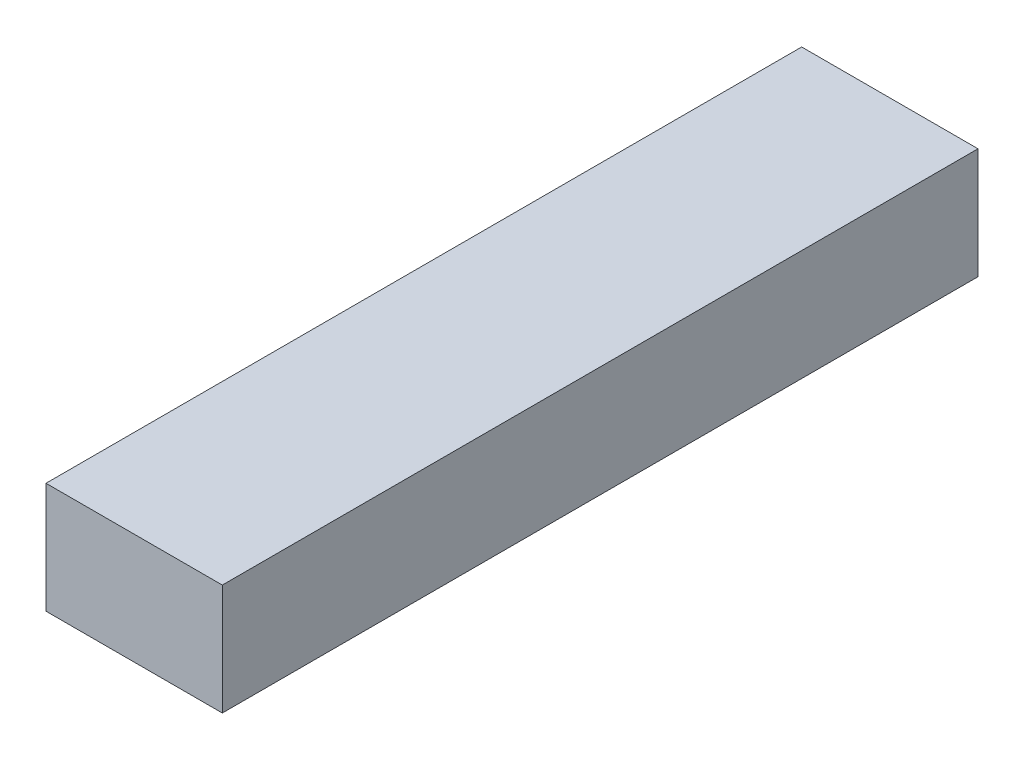
ISO-10303-21;
HEADER;
FILE_DESCRIPTION(('STEP AP214'),'2;1');
FILE_NAME('part.step','',(''),(''),'','','');
FILE_SCHEMA(('AUTOMOTIVE_DESIGN { 1 0 10303 214 1 1 1 1 }'));
ENDSEC;
DATA;
#1=APPLICATION_CONTEXT('core data for automotive mechanical design processes');
#2=APPLICATION_PROTOCOL_DEFINITION('international standard','automotive_design',2000,#1);
#3=PRODUCT_CONTEXT('',#1,'mechanical');
#4=PRODUCT('Part','Part','',(#3));
#5=PRODUCT_RELATED_PRODUCT_CATEGORY('part','',(#4));
#6=PRODUCT_DEFINITION_FORMATION('','',#4);
#7=PRODUCT_DEFINITION_CONTEXT('part definition',#1,'design');
#8=PRODUCT_DEFINITION('design','',#6,#7);
#9=PRODUCT_DEFINITION_SHAPE('','',#8);
#10=(LENGTH_UNIT() NAMED_UNIT(*) SI_UNIT(.MILLI.,.METRE.));
#11=(NAMED_UNIT(*) PLANE_ANGLE_UNIT() SI_UNIT($,.RADIAN.));
#12=(NAMED_UNIT(*) SI_UNIT($,.STERADIAN.) SOLID_ANGLE_UNIT());
#13=UNCERTAINTY_MEASURE_WITH_UNIT(LENGTH_MEASURE(1.E-05),#10,'distance_accuracy_value','');
#14=(GEOMETRIC_REPRESENTATION_CONTEXT(3) GLOBAL_UNCERTAINTY_ASSIGNED_CONTEXT((#13)) GLOBAL_UNIT_ASSIGNED_CONTEXT((#10,
#11,#12)) REPRESENTATION_CONTEXT('',''));
#15=CARTESIAN_POINT('',(0.,0.,0.));
#16=DIRECTION('',(0.,0.,1.));
#17=DIRECTION('',(1.,0.,0.));
#18=AXIS2_PLACEMENT_3D('',#15,#16,#17);
#19=CARTESIAN_POINT('',(35.,-22.,300.));
#20=DIRECTION('',(-1.,0.,0.));
#21=DIRECTION('',(0.,0.,1.));
#22=AXIS2_PLACEMENT_3D('',#19,#20,#21);
#23=PLANE('',#22);
#24=DIRECTION('',(0.,1.,0.));
#25=VECTOR('',#24,1.);
#26=CARTESIAN_POINT('',(35.,-22.,0.));
#27=LINE('',#26,#25);
#28=CARTESIAN_POINT('',(35.,-22.,0.));
#29=VERTEX_POINT('',#28);
#30=CARTESIAN_POINT('',(35.,22.,0.));
#31=VERTEX_POINT('',#30);
#32=EDGE_CURVE('E94',#29,#31,#27,.T.);
#33=ORIENTED_EDGE('',*,*,#32,.T.);
#34=DIRECTION('',(0.,0.,-1.));
#35=VECTOR('',#34,1.);
#36=CARTESIAN_POINT('',(35.,22.,300.));
#37=LINE('',#36,#35);
#38=CARTESIAN_POINT('',(35.,22.,300.));
#39=VERTEX_POINT('',#38);
#40=EDGE_CURVE('E11',#39,#31,#37,.T.);
#41=ORIENTED_EDGE('',*,*,#40,.F.);
#42=DIRECTION('',(0.,1.,0.));
#43=VECTOR('',#42,1.);
#44=CARTESIAN_POINT('',(35.,-22.,300.));
#45=LINE('',#44,#43);
#46=CARTESIAN_POINT('',(35.,-22.,300.));
#47=VERTEX_POINT('',#46);
#48=EDGE_CURVE('E82',#47,#39,#45,.T.);
#49=ORIENTED_EDGE('',*,*,#48,.F.);
#50=DIRECTION('',(0.,0.,-1.));
#51=VECTOR('',#50,1.);
#52=CARTESIAN_POINT('',(35.,-22.,300.));
#53=LINE('',#52,#51);
#54=EDGE_CURVE('E90',#47,#29,#53,.T.);
#55=ORIENTED_EDGE('',*,*,#54,.T.);
#56=EDGE_LOOP('',(#33,#41,#49,#55));
#57=FACE_BOUND('',#56,.T.);
#58=ADVANCED_FACE('F31',(#57),#23,.F.);
#59=CARTESIAN_POINT('',(-35.,22.,300.));
#60=DIRECTION('',(0.,-1.,0.));
#61=DIRECTION('',(0.,0.,-1.));
#62=AXIS2_PLACEMENT_3D('',#59,#60,#61);
#63=PLANE('',#62);
#64=DIRECTION('',(-1.,0.,0.));
#65=VECTOR('',#64,1.);
#66=CARTESIAN_POINT('',(-35.,22.,0.));
#67=LINE('',#66,#65);
#68=CARTESIAN_POINT('',(-35.,22.,0.));
#69=VERTEX_POINT('',#68);
#70=EDGE_CURVE('E86',#31,#69,#67,.T.);
#71=ORIENTED_EDGE('',*,*,#70,.T.);
#72=DIRECTION('',(0.,0.,-1.));
#73=VECTOR('',#72,1.);
#74=CARTESIAN_POINT('',(-35.,22.,300.));
#75=LINE('',#74,#73);
#76=CARTESIAN_POINT('',(-35.,22.,300.));
#77=VERTEX_POINT('',#76);
#78=EDGE_CURVE('E39',#77,#69,#75,.T.);
#79=ORIENTED_EDGE('',*,*,#78,.F.);
#80=DIRECTION('',(-1.,0.,0.));
#81=VECTOR('',#80,1.);
#82=CARTESIAN_POINT('',(-35.,22.,300.));
#83=LINE('',#82,#81);
#84=EDGE_CURVE('E77',#39,#77,#83,.T.);
#85=ORIENTED_EDGE('',*,*,#84,.F.);
#86=ORIENTED_EDGE('',*,*,#40,.T.);
#87=EDGE_LOOP('',(#71,#79,#85,#86));
#88=FACE_BOUND('',#87,.T.);
#89=ADVANCED_FACE('F85',(#88),#63,.F.);
#90=CARTESIAN_POINT('',(-35.,-22.,300.));
#91=DIRECTION('',(1.,0.,0.));
#92=DIRECTION('',(0.,0.,-1.));
#93=AXIS2_PLACEMENT_3D('',#90,#91,#92);
#94=PLANE('',#93);
#95=DIRECTION('',(0.,-1.,0.));
#96=VECTOR('',#95,1.);
#97=CARTESIAN_POINT('',(-35.,-22.,0.));
#98=LINE('',#97,#96);
#99=CARTESIAN_POINT('',(-35.,-22.,0.));
#100=VERTEX_POINT('',#99);
#101=EDGE_CURVE('E64',#69,#100,#98,.T.);
#102=ORIENTED_EDGE('',*,*,#101,.T.);
#103=DIRECTION('',(0.,0.,-1.));
#104=VECTOR('',#103,1.);
#105=CARTESIAN_POINT('',(-35.,-22.,300.));
#106=LINE('',#105,#104);
#107=CARTESIAN_POINT('',(-35.,-22.,300.));
#108=VERTEX_POINT('',#107);
#109=EDGE_CURVE('E87',#108,#100,#106,.T.);
#110=ORIENTED_EDGE('',*,*,#109,.F.);
#111=DIRECTION('',(0.,-1.,0.));
#112=VECTOR('',#111,1.);
#113=CARTESIAN_POINT('',(-35.,-22.,300.));
#114=LINE('',#113,#112);
#115=EDGE_CURVE('E80',#77,#108,#114,.T.);
#116=ORIENTED_EDGE('',*,*,#115,.F.);
#117=ORIENTED_EDGE('',*,*,#78,.T.);
#118=EDGE_LOOP('',(#102,#110,#116,#117));
#119=FACE_BOUND('',#118,.T.);
#120=ADVANCED_FACE('F88',(#119),#94,.F.);
#121=CARTESIAN_POINT('',(-35.,-22.,300.));
#122=DIRECTION('',(0.,1.,0.));
#123=DIRECTION('',(0.,0.,1.));
#124=AXIS2_PLACEMENT_3D('',#121,#122,#123);
#125=PLANE('',#124);
#126=DIRECTION('',(1.,0.,0.));
#127=VECTOR('',#126,1.);
#128=CARTESIAN_POINT('',(-35.,-22.,0.));
#129=LINE('',#128,#127);
#130=EDGE_CURVE('E70',#100,#29,#129,.T.);
#131=ORIENTED_EDGE('',*,*,#130,.T.);
#132=ORIENTED_EDGE('',*,*,#54,.F.);
#133=DIRECTION('',(1.,0.,0.));
#134=VECTOR('',#133,1.);
#135=CARTESIAN_POINT('',(-35.,-22.,300.));
#136=LINE('',#135,#134);
#137=EDGE_CURVE('E47',#108,#47,#136,.T.);
#138=ORIENTED_EDGE('',*,*,#137,.F.);
#139=ORIENTED_EDGE('',*,*,#109,.T.);
#140=EDGE_LOOP('',(#131,#132,#138,#139));
#141=FACE_BOUND('',#140,.T.);
#142=ADVANCED_FACE('F101',(#141),#125,.F.);
#143=CARTESIAN_POINT('',(35.,22.,300.));
#144=DIRECTION('',(0.,0.,-1.));
#145=DIRECTION('',(-1.,0.,0.));
#146=AXIS2_PLACEMENT_3D('',#143,#144,#145);
#147=PLANE('',#146);
#148=ORIENTED_EDGE('',*,*,#48,.T.);
#149=ORIENTED_EDGE('',*,*,#84,.T.);
#150=ORIENTED_EDGE('',*,*,#115,.T.);
#151=ORIENTED_EDGE('',*,*,#137,.T.);
#152=EDGE_LOOP('',(#148,#149,#150,#151));
#153=FACE_BOUND('',#152,.T.);
#154=ADVANCED_FACE('F78',(#153),#147,.F.);
#155=CARTESIAN_POINT('',(35.,22.,0.));
#156=DIRECTION('',(0.,0.,-1.));
#157=DIRECTION('',(-1.,0.,0.));
#158=AXIS2_PLACEMENT_3D('',#155,#156,#157);
#159=PLANE('',#158);
#160=ORIENTED_EDGE('',*,*,#32,.F.);
#161=ORIENTED_EDGE('',*,*,#130,.F.);
#162=ORIENTED_EDGE('',*,*,#101,.F.);
#163=ORIENTED_EDGE('',*,*,#70,.F.);
#164=EDGE_LOOP('',(#160,#161,#162,#163));
#165=FACE_BOUND('',#164,.T.);
#166=ADVANCED_FACE('F104',(#165),#159,.T.);
#167=CLOSED_SHELL('',(#58,#89,#120,#142,#154,#166));
#168=MANIFOLD_SOLID_BREP('B2',#167);
#169=ADVANCED_BREP_SHAPE_REPRESENTATION('',(#18,#168),#14);
#170=SHAPE_DEFINITION_REPRESENTATION(#9,#169);
ENDSEC;
END-ISO-10303-21;
